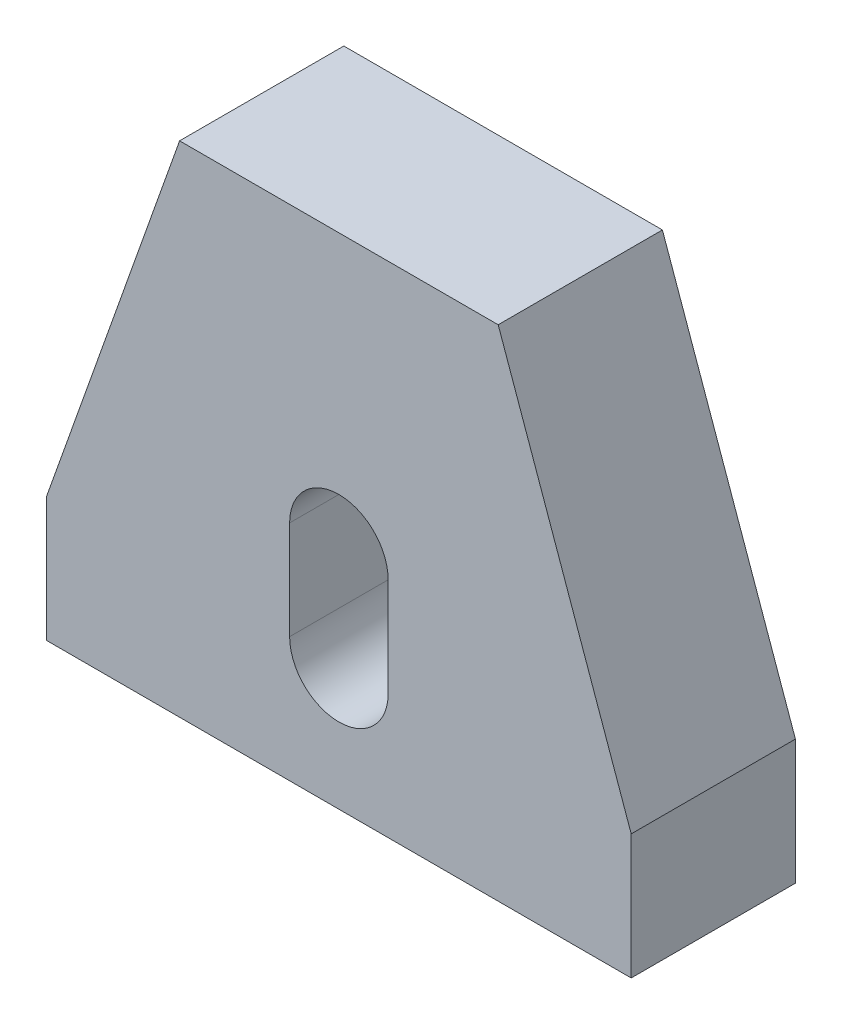
ISO-10303-21;
HEADER;
FILE_DESCRIPTION(('STEP AP214'),'2;1');
FILE_NAME('part.step','',(''),(''),'','','');
FILE_SCHEMA(('AUTOMOTIVE_DESIGN { 1 0 10303 214 1 1 1 1 }'));
ENDSEC;
DATA;
#1=APPLICATION_CONTEXT('core data for automotive mechanical design processes');
#2=APPLICATION_PROTOCOL_DEFINITION('international standard','automotive_design',2000,#1);
#3=PRODUCT_CONTEXT('',#1,'mechanical');
#4=PRODUCT('Part','Part','',(#3));
#5=PRODUCT_RELATED_PRODUCT_CATEGORY('part','',(#4));
#6=PRODUCT_DEFINITION_FORMATION('','',#4);
#7=PRODUCT_DEFINITION_CONTEXT('part definition',#1,'design');
#8=PRODUCT_DEFINITION('design','',#6,#7);
#9=PRODUCT_DEFINITION_SHAPE('','',#8);
#10=(LENGTH_UNIT() NAMED_UNIT(*) SI_UNIT(.MILLI.,.METRE.));
#11=(NAMED_UNIT(*) PLANE_ANGLE_UNIT() SI_UNIT($,.RADIAN.));
#12=(NAMED_UNIT(*) SI_UNIT($,.STERADIAN.) SOLID_ANGLE_UNIT());
#13=UNCERTAINTY_MEASURE_WITH_UNIT(LENGTH_MEASURE(1.E-05),#10,'distance_accuracy_value','');
#14=(GEOMETRIC_REPRESENTATION_CONTEXT(3) GLOBAL_UNCERTAINTY_ASSIGNED_CONTEXT((#13)) GLOBAL_UNIT_ASSIGNED_CONTEXT((#10,
#11,#12)) REPRESENTATION_CONTEXT('',''));
#15=CARTESIAN_POINT('',(0.,0.,0.));
#16=DIRECTION('',(0.,0.,1.));
#17=DIRECTION('',(1.,0.,0.));
#18=AXIS2_PLACEMENT_3D('',#15,#16,#17);
#19=CARTESIAN_POINT('',(0.,0.,2.5));
#20=DIRECTION('',(0.,0.,-1.));
#21=DIRECTION('',(-1.,0.,0.));
#22=AXIS2_PLACEMENT_3D('',#19,#20,#21);
#23=PLANE('',#22);
#24=DIRECTION('',(-0.334765052352706,-0.942301628844655,0.));
#25=VECTOR('',#24,1.);
#26=CARTESIAN_POINT('',(-8.9,-3.,2.5));
#27=LINE('',#26,#25);
#28=CARTESIAN_POINT('',(-4.85,8.4,2.5));
#29=VERTEX_POINT('',#28);
#30=CARTESIAN_POINT('',(-8.9,-3.,2.5));
#31=VERTEX_POINT('',#30);
#32=EDGE_CURVE('E146',#29,#31,#27,.T.);
#33=ORIENTED_EDGE('',*,*,#32,.T.);
#34=DIRECTION('',(0.,-1.,0.));
#35=VECTOR('',#34,1.);
#36=CARTESIAN_POINT('',(-8.9,-6.8,2.5));
#37=LINE('',#36,#35);
#38=CARTESIAN_POINT('',(-8.9,-6.8,2.5));
#39=VERTEX_POINT('',#38);
#40=EDGE_CURVE('E149',#31,#39,#37,.T.);
#41=ORIENTED_EDGE('',*,*,#40,.T.);
#42=DIRECTION('',(1.,0.,0.));
#43=VECTOR('',#42,1.);
#44=CARTESIAN_POINT('',(8.9,-6.8,2.5));
#45=LINE('',#44,#43);
#46=CARTESIAN_POINT('',(8.9,-6.8,2.5));
#47=VERTEX_POINT('',#46);
#48=EDGE_CURVE('E152',#39,#47,#45,.T.);
#49=ORIENTED_EDGE('',*,*,#48,.T.);
#50=DIRECTION('',(0.,1.,0.));
#51=VECTOR('',#50,1.);
#52=CARTESIAN_POINT('',(8.9,-3.,2.5));
#53=LINE('',#52,#51);
#54=CARTESIAN_POINT('',(8.9,-3.,2.5));
#55=VERTEX_POINT('',#54);
#56=EDGE_CURVE('E154',#47,#55,#53,.T.);
#57=ORIENTED_EDGE('',*,*,#56,.T.);
#58=DIRECTION('',(-0.334765052352706,0.942301628844655,0.));
#59=VECTOR('',#58,1.);
#60=CARTESIAN_POINT('',(4.85,8.4,2.5));
#61=LINE('',#60,#59);
#62=CARTESIAN_POINT('',(4.85,8.4,2.5));
#63=VERTEX_POINT('',#62);
#64=EDGE_CURVE('E156',#55,#63,#61,.T.);
#65=ORIENTED_EDGE('',*,*,#64,.T.);
#66=DIRECTION('',(-1.,0.,0.));
#67=VECTOR('',#66,1.);
#68=CARTESIAN_POINT('',(-4.85,8.4,2.5));
#69=LINE('',#68,#67);
#70=EDGE_CURVE('E158',#63,#29,#69,.T.);
#71=ORIENTED_EDGE('',*,*,#70,.T.);
#72=EDGE_LOOP('',(#33,#41,#49,#57,#65,#71));
#73=FACE_BOUND('',#72,.T.);
#74=CARTESIAN_POINT('',(0.,0.,2.5));
#75=DIRECTION('',(0.,0.,1.));
#76=DIRECTION('',(1.,0.,0.));
#77=AXIS2_PLACEMENT_3D('',#74,#75,#76);
#78=CIRCLE('',#77,1.5);
#79=CARTESIAN_POINT('',(1.5,0.,2.5));
#80=VERTEX_POINT('',#79);
#81=CARTESIAN_POINT('',(-1.5,0.,2.5));
#82=VERTEX_POINT('',#81);
#83=EDGE_CURVE('E110',#80,#82,#78,.T.);
#84=ORIENTED_EDGE('',*,*,#83,.F.);
#85=DIRECTION('',(0.,1.,0.));
#86=VECTOR('',#85,1.);
#87=CARTESIAN_POINT('',(1.5,0.,2.5));
#88=LINE('',#87,#86);
#89=CARTESIAN_POINT('',(1.5,-3.,2.5));
#90=VERTEX_POINT('',#89);
#91=EDGE_CURVE('E132',#90,#80,#88,.T.);
#92=ORIENTED_EDGE('',*,*,#91,.F.);
#93=CARTESIAN_POINT('',(0.,-3.,2.5));
#94=DIRECTION('',(0.,0.,1.));
#95=DIRECTION('',(1.,0.,0.));
#96=AXIS2_PLACEMENT_3D('',#93,#94,#95);
#97=CIRCLE('',#96,1.5);
#98=CARTESIAN_POINT('',(-1.5,-3.,2.5));
#99=VERTEX_POINT('',#98);
#100=EDGE_CURVE('E130',#99,#90,#97,.T.);
#101=ORIENTED_EDGE('',*,*,#100,.F.);
#102=DIRECTION('',(0.,-1.,0.));
#103=VECTOR('',#102,1.);
#104=CARTESIAN_POINT('',(-1.5,0.,2.5));
#105=LINE('',#104,#103);
#106=EDGE_CURVE('E118',#82,#99,#105,.T.);
#107=ORIENTED_EDGE('',*,*,#106,.F.);
#108=EDGE_LOOP('',(#84,#92,#101,#107));
#109=FACE_BOUND('',#108,.T.);
#110=ADVANCED_FACE('F33',(#73,#109),#23,.F.);
#111=CARTESIAN_POINT('',(0.,0.,-2.5));
#112=DIRECTION('',(0.,0.,-1.));
#113=DIRECTION('',(-1.,0.,0.));
#114=AXIS2_PLACEMENT_3D('',#111,#112,#113);
#115=PLANE('',#114);
#116=DIRECTION('',(-0.334765052352706,-0.942301628844655,0.));
#117=VECTOR('',#116,1.);
#118=CARTESIAN_POINT('',(-8.9,-3.,-2.5));
#119=LINE('',#118,#117);
#120=CARTESIAN_POINT('',(-4.85,8.4,-2.5));
#121=VERTEX_POINT('',#120);
#122=CARTESIAN_POINT('',(-8.9,-3.,-2.5));
#123=VERTEX_POINT('',#122);
#124=EDGE_CURVE('E126',#121,#123,#119,.T.);
#125=ORIENTED_EDGE('',*,*,#124,.F.);
#126=DIRECTION('',(-1.,0.,0.));
#127=VECTOR('',#126,1.);
#128=CARTESIAN_POINT('',(-4.85,8.4,-2.5));
#129=LINE('',#128,#127);
#130=CARTESIAN_POINT('',(4.85,8.4,-2.5));
#131=VERTEX_POINT('',#130);
#132=EDGE_CURVE('E150',#131,#121,#129,.T.);
#133=ORIENTED_EDGE('',*,*,#132,.F.);
#134=DIRECTION('',(-0.334765052352706,0.942301628844655,0.));
#135=VECTOR('',#134,1.);
#136=CARTESIAN_POINT('',(4.85,8.4,-2.5));
#137=LINE('',#136,#135);
#138=CARTESIAN_POINT('',(8.9,-3.,-2.5));
#139=VERTEX_POINT('',#138);
#140=EDGE_CURVE('E169',#139,#131,#137,.T.);
#141=ORIENTED_EDGE('',*,*,#140,.F.);
#142=DIRECTION('',(0.,1.,0.));
#143=VECTOR('',#142,1.);
#144=CARTESIAN_POINT('',(8.9,-3.,-2.5));
#145=LINE('',#144,#143);
#146=CARTESIAN_POINT('',(8.9,-6.8,-2.5));
#147=VERTEX_POINT('',#146);
#148=EDGE_CURVE('E167',#147,#139,#145,.T.);
#149=ORIENTED_EDGE('',*,*,#148,.F.);
#150=DIRECTION('',(1.,0.,0.));
#151=VECTOR('',#150,1.);
#152=CARTESIAN_POINT('',(8.9,-6.8,-2.5));
#153=LINE('',#152,#151);
#154=CARTESIAN_POINT('',(-8.9,-6.8,-2.5));
#155=VERTEX_POINT('',#154);
#156=EDGE_CURVE('E165',#155,#147,#153,.T.);
#157=ORIENTED_EDGE('',*,*,#156,.F.);
#158=DIRECTION('',(0.,-1.,0.));
#159=VECTOR('',#158,1.);
#160=CARTESIAN_POINT('',(-8.9,-6.8,-2.5));
#161=LINE('',#160,#159);
#162=EDGE_CURVE('E163',#123,#155,#161,.T.);
#163=ORIENTED_EDGE('',*,*,#162,.F.);
#164=EDGE_LOOP('',(#125,#133,#141,#149,#157,#163));
#165=FACE_BOUND('',#164,.T.);
#166=DIRECTION('',(0.,1.,0.));
#167=VECTOR('',#166,1.);
#168=CARTESIAN_POINT('',(1.5,0.,-2.5));
#169=LINE('',#168,#167);
#170=CARTESIAN_POINT('',(1.5,-3.,-2.5));
#171=VERTEX_POINT('',#170);
#172=CARTESIAN_POINT('',(1.5,0.,-2.5));
#173=VERTEX_POINT('',#172);
#174=EDGE_CURVE('E119',#171,#173,#169,.T.);
#175=ORIENTED_EDGE('',*,*,#174,.T.);
#176=CARTESIAN_POINT('',(0.,0.,-2.5));
#177=DIRECTION('',(0.,0.,1.));
#178=DIRECTION('',(1.,0.,0.));
#179=AXIS2_PLACEMENT_3D('',#176,#177,#178);
#180=CIRCLE('',#179,1.5);
#181=CARTESIAN_POINT('',(-1.5,0.,-2.5));
#182=VERTEX_POINT('',#181);
#183=EDGE_CURVE('E56',#173,#182,#180,.T.);
#184=ORIENTED_EDGE('',*,*,#183,.T.);
#185=DIRECTION('',(0.,-1.,0.));
#186=VECTOR('',#185,1.);
#187=CARTESIAN_POINT('',(-1.5,0.,-2.5));
#188=LINE('',#187,#186);
#189=CARTESIAN_POINT('',(-1.5,-3.,-2.5));
#190=VERTEX_POINT('',#189);
#191=EDGE_CURVE('E125',#182,#190,#188,.T.);
#192=ORIENTED_EDGE('',*,*,#191,.T.);
#193=CARTESIAN_POINT('',(0.,-3.,-2.5));
#194=DIRECTION('',(0.,0.,1.));
#195=DIRECTION('',(1.,0.,0.));
#196=AXIS2_PLACEMENT_3D('',#193,#194,#195);
#197=CIRCLE('',#196,1.5);
#198=EDGE_CURVE('E138',#190,#171,#197,.T.);
#199=ORIENTED_EDGE('',*,*,#198,.T.);
#200=EDGE_LOOP('',(#175,#184,#192,#199));
#201=FACE_BOUND('',#200,.T.);
#202=ADVANCED_FACE('F193',(#165,#201),#115,.T.);
#203=CARTESIAN_POINT('',(-8.9,-3.,2.5));
#204=DIRECTION('',(0.942301628844655,-0.334765052352706,0.));
#205=DIRECTION('',(0.334765052352706,0.942301628844655,0.));
#206=AXIS2_PLACEMENT_3D('',#203,#204,#205);
#207=PLANE('',#206);
#208=ORIENTED_EDGE('',*,*,#124,.T.);
#209=DIRECTION('',(0.,0.,-1.));
#210=VECTOR('',#209,1.);
#211=CARTESIAN_POINT('',(-8.9,-3.,2.5));
#212=LINE('',#211,#210);
#213=EDGE_CURVE('E11',#31,#123,#212,.T.);
#214=ORIENTED_EDGE('',*,*,#213,.F.);
#215=ORIENTED_EDGE('',*,*,#32,.F.);
#216=DIRECTION('',(0.,0.,-1.));
#217=VECTOR('',#216,1.);
#218=CARTESIAN_POINT('',(-4.85,8.4,2.5));
#219=LINE('',#218,#217);
#220=EDGE_CURVE('E160',#29,#121,#219,.T.);
#221=ORIENTED_EDGE('',*,*,#220,.T.);
#222=EDGE_LOOP('',(#208,#214,#215,#221));
#223=FACE_BOUND('',#222,.T.);
#224=ADVANCED_FACE('F35',(#223),#207,.F.);
#225=CARTESIAN_POINT('',(-8.9,-6.8,2.5));
#226=DIRECTION('',(1.,0.,0.));
#227=DIRECTION('',(0.,1.,0.));
#228=AXIS2_PLACEMENT_3D('',#225,#226,#227);
#229=PLANE('',#228);
#230=ORIENTED_EDGE('',*,*,#162,.T.);
#231=DIRECTION('',(0.,0.,-1.));
#232=VECTOR('',#231,1.);
#233=CARTESIAN_POINT('',(-8.9,-6.8,2.5));
#234=LINE('',#233,#232);
#235=EDGE_CURVE('E41',#39,#155,#234,.T.);
#236=ORIENTED_EDGE('',*,*,#235,.F.);
#237=ORIENTED_EDGE('',*,*,#40,.F.);
#238=ORIENTED_EDGE('',*,*,#213,.T.);
#239=EDGE_LOOP('',(#230,#236,#237,#238));
#240=FACE_BOUND('',#239,.T.);
#241=ADVANCED_FACE('F210',(#240),#229,.F.);
#242=CARTESIAN_POINT('',(8.9,-6.8,2.5));
#243=DIRECTION('',(0.,1.,0.));
#244=DIRECTION('',(-1.,0.,0.));
#245=AXIS2_PLACEMENT_3D('',#242,#243,#244);
#246=PLANE('',#245);
#247=ORIENTED_EDGE('',*,*,#156,.T.);
#248=DIRECTION('',(0.,0.,-1.));
#249=VECTOR('',#248,1.);
#250=CARTESIAN_POINT('',(8.9,-6.8,2.5));
#251=LINE('',#250,#249);
#252=EDGE_CURVE('E180',#47,#147,#251,.T.);
#253=ORIENTED_EDGE('',*,*,#252,.F.);
#254=ORIENTED_EDGE('',*,*,#48,.F.);
#255=ORIENTED_EDGE('',*,*,#235,.T.);
#256=EDGE_LOOP('',(#247,#253,#254,#255));
#257=FACE_BOUND('',#256,.T.);
#258=ADVANCED_FACE('F187',(#257),#246,.F.);
#259=CARTESIAN_POINT('',(8.9,-3.,2.5));
#260=DIRECTION('',(-1.,0.,0.));
#261=DIRECTION('',(0.,-1.,0.));
#262=AXIS2_PLACEMENT_3D('',#259,#260,#261);
#263=PLANE('',#262);
#264=ORIENTED_EDGE('',*,*,#148,.T.);
#265=DIRECTION('',(0.,0.,-1.));
#266=VECTOR('',#265,1.);
#267=CARTESIAN_POINT('',(8.9,-3.,2.5));
#268=LINE('',#267,#266);
#269=EDGE_CURVE('E177',#55,#139,#268,.T.);
#270=ORIENTED_EDGE('',*,*,#269,.F.);
#271=ORIENTED_EDGE('',*,*,#56,.F.);
#272=ORIENTED_EDGE('',*,*,#252,.T.);
#273=EDGE_LOOP('',(#264,#270,#271,#272));
#274=FACE_BOUND('',#273,.T.);
#275=ADVANCED_FACE('F199',(#274),#263,.F.);
#276=CARTESIAN_POINT('',(4.85,8.4,2.5));
#277=DIRECTION('',(-0.942301628844655,-0.334765052352706,0.));
#278=DIRECTION('',(0.334765052352706,-0.942301628844655,0.));
#279=AXIS2_PLACEMENT_3D('',#276,#277,#278);
#280=PLANE('',#279);
#281=ORIENTED_EDGE('',*,*,#140,.T.);
#282=DIRECTION('',(0.,0.,-1.));
#283=VECTOR('',#282,1.);
#284=CARTESIAN_POINT('',(4.85,8.4,2.5));
#285=LINE('',#284,#283);
#286=EDGE_CURVE('E174',#63,#131,#285,.T.);
#287=ORIENTED_EDGE('',*,*,#286,.F.);
#288=ORIENTED_EDGE('',*,*,#64,.F.);
#289=ORIENTED_EDGE('',*,*,#269,.T.);
#290=EDGE_LOOP('',(#281,#287,#288,#289));
#291=FACE_BOUND('',#290,.T.);
#292=ADVANCED_FACE('F203',(#291),#280,.F.);
#293=CARTESIAN_POINT('',(-4.85,8.4,2.5));
#294=DIRECTION('',(0.,-1.,0.));
#295=DIRECTION('',(0.,0.,-1.));
#296=AXIS2_PLACEMENT_3D('',#293,#294,#295);
#297=PLANE('',#296);
#298=ORIENTED_EDGE('',*,*,#132,.T.);
#299=ORIENTED_EDGE('',*,*,#220,.F.);
#300=ORIENTED_EDGE('',*,*,#70,.F.);
#301=ORIENTED_EDGE('',*,*,#286,.T.);
#302=EDGE_LOOP('',(#298,#299,#300,#301));
#303=FACE_BOUND('',#302,.T.);
#304=ADVANCED_FACE('F213',(#303),#297,.F.);
#305=CARTESIAN_POINT('',(0.,0.,2.5));
#306=DIRECTION('',(0.,0.,-1.));
#307=DIRECTION('',(-1.,0.,0.));
#308=AXIS2_PLACEMENT_3D('',#305,#306,#307);
#309=CYLINDRICAL_SURFACE('',#308,1.5);
#310=ORIENTED_EDGE('',*,*,#183,.F.);
#311=DIRECTION('',(0.,0.,-1.));
#312=VECTOR('',#311,1.);
#313=CARTESIAN_POINT('',(1.5,0.,2.5));
#314=LINE('',#313,#312);
#315=EDGE_CURVE('E114',#80,#173,#314,.T.);
#316=ORIENTED_EDGE('',*,*,#315,.F.);
#317=ORIENTED_EDGE('',*,*,#83,.T.);
#318=DIRECTION('',(0.,0.,-1.));
#319=VECTOR('',#318,1.);
#320=CARTESIAN_POINT('',(-1.5,0.,2.5));
#321=LINE('',#320,#319);
#322=EDGE_CURVE('E113',#82,#182,#321,.T.);
#323=ORIENTED_EDGE('',*,*,#322,.T.);
#324=EDGE_LOOP('',(#310,#316,#317,#323));
#325=FACE_BOUND('',#324,.T.);
#326=ADVANCED_FACE('F112',(#325),#309,.F.);
#327=CARTESIAN_POINT('',(-1.5,0.,2.5));
#328=DIRECTION('',(1.,0.,0.));
#329=DIRECTION('',(0.,1.,0.));
#330=AXIS2_PLACEMENT_3D('',#327,#328,#329);
#331=PLANE('',#330);
#332=ORIENTED_EDGE('',*,*,#191,.F.);
#333=ORIENTED_EDGE('',*,*,#322,.F.);
#334=ORIENTED_EDGE('',*,*,#106,.T.);
#335=DIRECTION('',(0.,0.,-1.));
#336=VECTOR('',#335,1.);
#337=CARTESIAN_POINT('',(-1.5,-3.,2.5));
#338=LINE('',#337,#336);
#339=EDGE_CURVE('E127',#99,#190,#338,.T.);
#340=ORIENTED_EDGE('',*,*,#339,.T.);
#341=EDGE_LOOP('',(#332,#333,#334,#340));
#342=FACE_BOUND('',#341,.T.);
#343=ADVANCED_FACE('F122',(#342),#331,.T.);
#344=CARTESIAN_POINT('',(0.,-3.,2.5));
#345=DIRECTION('',(0.,0.,-1.));
#346=DIRECTION('',(-1.,0.,0.));
#347=AXIS2_PLACEMENT_3D('',#344,#345,#346);
#348=CYLINDRICAL_SURFACE('',#347,1.5);
#349=ORIENTED_EDGE('',*,*,#198,.F.);
#350=ORIENTED_EDGE('',*,*,#339,.F.);
#351=ORIENTED_EDGE('',*,*,#100,.T.);
#352=DIRECTION('',(0.,0.,-1.));
#353=VECTOR('',#352,1.);
#354=CARTESIAN_POINT('',(1.5,-3.,2.5));
#355=LINE('',#354,#353);
#356=EDGE_CURVE('E48',#90,#171,#355,.T.);
#357=ORIENTED_EDGE('',*,*,#356,.T.);
#358=EDGE_LOOP('',(#349,#350,#351,#357));
#359=FACE_BOUND('',#358,.T.);
#360=ADVANCED_FACE('F231',(#359),#348,.F.);
#361=CARTESIAN_POINT('',(1.5,0.,2.5));
#362=DIRECTION('',(-1.,0.,0.));
#363=DIRECTION('',(0.,-1.,0.));
#364=AXIS2_PLACEMENT_3D('',#361,#362,#363);
#365=PLANE('',#364);
#366=ORIENTED_EDGE('',*,*,#174,.F.);
#367=ORIENTED_EDGE('',*,*,#356,.F.);
#368=ORIENTED_EDGE('',*,*,#91,.T.);
#369=ORIENTED_EDGE('',*,*,#315,.T.);
#370=EDGE_LOOP('',(#366,#367,#368,#369));
#371=FACE_BOUND('',#370,.T.);
#372=ADVANCED_FACE('F234',(#371),#365,.T.);
#373=CLOSED_SHELL('',(#110,#202,#224,#241,#258,#275,#292,#304,#326,#343,#360,#372));
#374=MANIFOLD_SOLID_BREP('B2',#373);
#375=ADVANCED_BREP_SHAPE_REPRESENTATION('',(#18,#374),#14);
#376=SHAPE_DEFINITION_REPRESENTATION(#9,#375);
ENDSEC;
END-ISO-10303-21;
